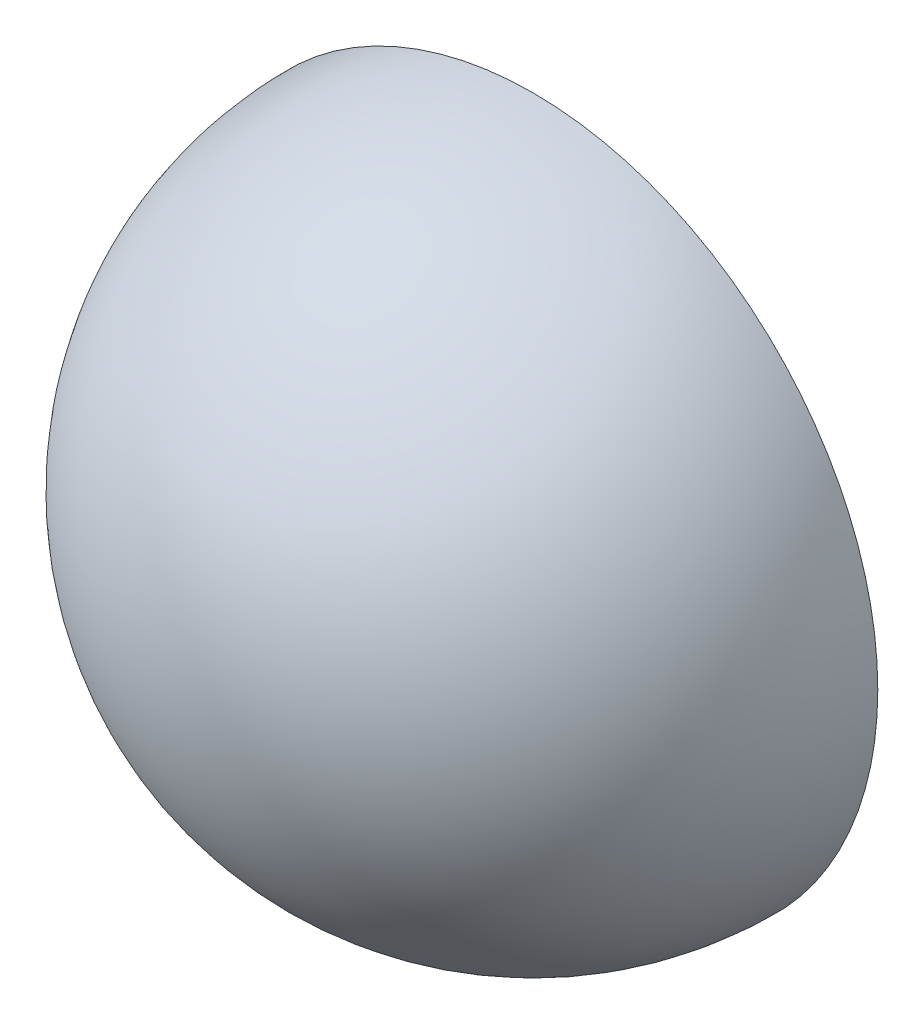
ISO-10303-21;
HEADER;
FILE_DESCRIPTION(('STEP AP214'),'2;1');
FILE_NAME('part.step','',(''),(''),'','','');
FILE_SCHEMA(('AUTOMOTIVE_DESIGN { 1 0 10303 214 1 1 1 1 }'));
ENDSEC;
DATA;
#1=APPLICATION_CONTEXT('core data for automotive mechanical design processes');
#2=APPLICATION_PROTOCOL_DEFINITION('international standard','automotive_design',2000,#1);
#3=PRODUCT_CONTEXT('',#1,'mechanical');
#4=PRODUCT('Part','Part','',(#3));
#5=PRODUCT_RELATED_PRODUCT_CATEGORY('part','',(#4));
#6=PRODUCT_DEFINITION_FORMATION('','',#4);
#7=PRODUCT_DEFINITION_CONTEXT('part definition',#1,'design');
#8=PRODUCT_DEFINITION('design','',#6,#7);
#9=PRODUCT_DEFINITION_SHAPE('','',#8);
#10=(LENGTH_UNIT() NAMED_UNIT(*) SI_UNIT(.MILLI.,.METRE.));
#11=(NAMED_UNIT(*) PLANE_ANGLE_UNIT() SI_UNIT($,.RADIAN.));
#12=(NAMED_UNIT(*) SI_UNIT($,.STERADIAN.) SOLID_ANGLE_UNIT());
#13=UNCERTAINTY_MEASURE_WITH_UNIT(LENGTH_MEASURE(1.E-05),#10,'distance_accuracy_value','');
#14=(GEOMETRIC_REPRESENTATION_CONTEXT(3) GLOBAL_UNCERTAINTY_ASSIGNED_CONTEXT((#13)) GLOBAL_UNIT_ASSIGNED_CONTEXT((#10,
#11,#12)) REPRESENTATION_CONTEXT('',''));
#15=CARTESIAN_POINT('',(0.,0.,0.));
#16=DIRECTION('',(0.,0.,1.));
#17=DIRECTION('',(1.,0.,0.));
#18=AXIS2_PLACEMENT_3D('',#15,#16,#17);
#19=CARTESIAN_POINT('',(0.,0.,0.));
#20=DIRECTION('',(0.,0.,-1.));
#21=DIRECTION('',(-1.,0.,0.));
#22=AXIS2_PLACEMENT_3D('',#19,#20,#21);
#23=PLANE('',#22);
#24=CARTESIAN_POINT('',(0.,0.,0.));
#25=DIRECTION('',(0.,0.,1.));
#26=DIRECTION('',(1.,0.,0.));
#27=AXIS2_PLACEMENT_3D('',#24,#25,#26);
#28=CIRCLE('',#27,0.856223003735196);
#29=CARTESIAN_POINT('',(0.856223003735196,0.,0.));
#30=VERTEX_POINT('',#29);
#31=CARTESIAN_POINT('',(-0.856223003735196,0.,0.));
#32=VERTEX_POINT('',#31);
#33=EDGE_CURVE('E20',#30,#32,#28,.T.);
#34=ORIENTED_EDGE('',*,*,#33,.F.);
#35=CARTESIAN_POINT('',(0.,0.,0.));
#36=DIRECTION('',(0.,0.,-1.));
#37=DIRECTION('',(1.,0.,0.));
#38=AXIS2_PLACEMENT_3D('',#35,#36,#37);
#39=CIRCLE('',#38,0.856223003735196);
#40=EDGE_CURVE('E11',#32,#30,#39,.F.);
#41=ORIENTED_EDGE('',*,*,#40,.F.);
#42=EDGE_LOOP('',(#34,#41));
#43=FACE_BOUND('',#42,.T.);
#44=ADVANCED_FACE('F17',(#43),#23,.T.);
#45=CARTESIAN_POINT('',(0.,0.,0.));
#46=DIRECTION('',(1.,0.,0.));
#47=DIRECTION('',(0.,1.,0.));
#48=AXIS2_PLACEMENT_3D('',#45,#46,#47);
#49=SPHERICAL_SURFACE('',#48,0.856223003735196);
#50=ORIENTED_EDGE('',*,*,#33,.T.);
#51=ORIENTED_EDGE('',*,*,#40,.T.);
#52=EDGE_LOOP('',(#50,#51));
#53=FACE_BOUND('',#52,.T.);
#54=ADVANCED_FACE('F31',(#53),#49,.T.);
#55=CLOSED_SHELL('',(#44,#54));
#56=MANIFOLD_SOLID_BREP('B1',#55);
#57=ADVANCED_BREP_SHAPE_REPRESENTATION('',(#18,#56),#14);
#58=SHAPE_DEFINITION_REPRESENTATION(#9,#57);
ENDSEC;
END-ISO-10303-21;
